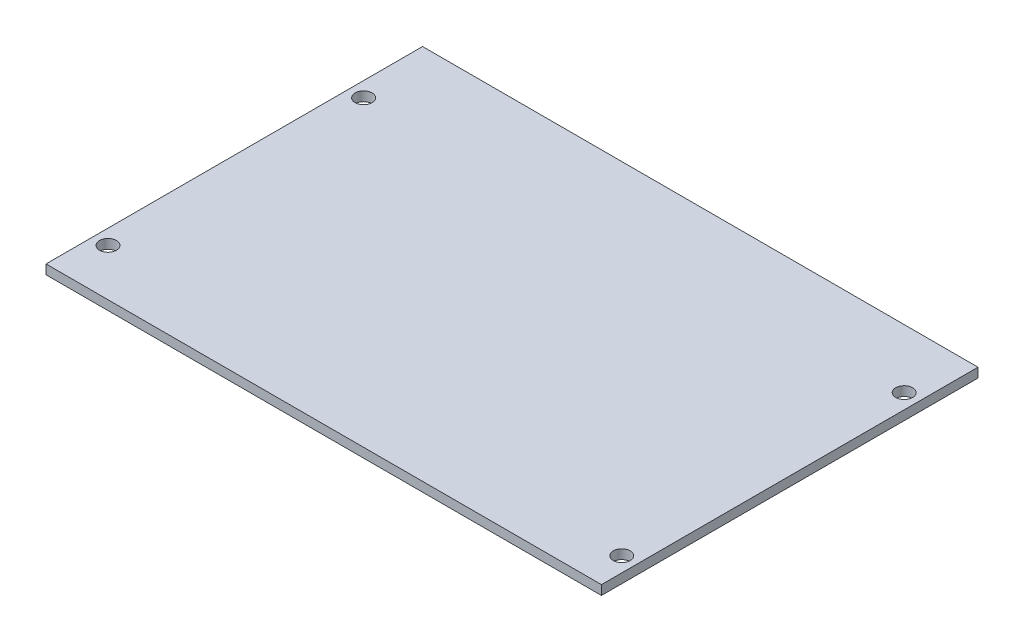
ISO-10303-21;
HEADER;
FILE_DESCRIPTION(('STEP AP214'),'2;1');
FILE_NAME('part.step','',(''),(''),'','','');
FILE_SCHEMA(('AUTOMOTIVE_DESIGN { 1 0 10303 214 1 1 1 1 }'));
ENDSEC;
DATA;
#1=APPLICATION_CONTEXT('core data for automotive mechanical design processes');
#2=APPLICATION_PROTOCOL_DEFINITION('international standard','automotive_design',2000,#1);
#3=PRODUCT_CONTEXT('',#1,'mechanical');
#4=PRODUCT('Part','Part','',(#3));
#5=PRODUCT_RELATED_PRODUCT_CATEGORY('part','',(#4));
#6=PRODUCT_DEFINITION_FORMATION('','',#4);
#7=PRODUCT_DEFINITION_CONTEXT('part definition',#1,'design');
#8=PRODUCT_DEFINITION('design','',#6,#7);
#9=PRODUCT_DEFINITION_SHAPE('','',#8);
#10=(LENGTH_UNIT() NAMED_UNIT(*) SI_UNIT(.MILLI.,.METRE.));
#11=(NAMED_UNIT(*) PLANE_ANGLE_UNIT() SI_UNIT($,.RADIAN.));
#12=(NAMED_UNIT(*) SI_UNIT($,.STERADIAN.) SOLID_ANGLE_UNIT());
#13=UNCERTAINTY_MEASURE_WITH_UNIT(LENGTH_MEASURE(1.E-05),#10,'distance_accuracy_value','');
#14=(GEOMETRIC_REPRESENTATION_CONTEXT(3) GLOBAL_UNCERTAINTY_ASSIGNED_CONTEXT((#13)) GLOBAL_UNIT_ASSIGNED_CONTEXT((#10,
#11,#12)) REPRESENTATION_CONTEXT('',''));
#15=CARTESIAN_POINT('',(0.,0.,0.));
#16=DIRECTION('',(0.,0.,1.));
#17=DIRECTION('',(1.,0.,0.));
#18=AXIS2_PLACEMENT_3D('',#15,#16,#17);
#19=CARTESIAN_POINT('',(0.,3.,0.));
#20=DIRECTION('',(0.,-1.,0.));
#21=DIRECTION('',(0.,0.,-1.));
#22=AXIS2_PLACEMENT_3D('',#19,#20,#21);
#23=PLANE('',#22);
#24=DIRECTION('',(0.,0.,-1.));
#25=VECTOR('',#24,1.);
#26=CARTESIAN_POINT('',(88.5,3.,60.));
#27=LINE('',#26,#25);
#28=CARTESIAN_POINT('',(88.5,3.,60.));
#29=VERTEX_POINT('',#28);
#30=CARTESIAN_POINT('',(88.5,3.,-60.));
#31=VERTEX_POINT('',#30);
#32=EDGE_CURVE('E85',#29,#31,#27,.T.);
#33=ORIENTED_EDGE('',*,*,#32,.T.);
#34=DIRECTION('',(-1.,0.,0.));
#35=VECTOR('',#34,1.);
#36=CARTESIAN_POINT('',(-88.5,3.,-60.));
#37=LINE('',#36,#35);
#38=CARTESIAN_POINT('',(-88.5,3.,-60.));
#39=VERTEX_POINT('',#38);
#40=EDGE_CURVE('E80',#31,#39,#37,.T.);
#41=ORIENTED_EDGE('',*,*,#40,.T.);
#42=DIRECTION('',(0.,0.,1.));
#43=VECTOR('',#42,1.);
#44=CARTESIAN_POINT('',(-88.5,3.,60.));
#45=LINE('',#44,#43);
#46=CARTESIAN_POINT('',(-88.5,3.,60.));
#47=VERTEX_POINT('',#46);
#48=EDGE_CURVE('E83',#39,#47,#45,.T.);
#49=ORIENTED_EDGE('',*,*,#48,.T.);
#50=DIRECTION('',(1.,0.,0.));
#51=VECTOR('',#50,1.);
#52=CARTESIAN_POINT('',(-88.5,3.,60.));
#53=LINE('',#52,#51);
#54=EDGE_CURVE('E50',#47,#29,#53,.T.);
#55=ORIENTED_EDGE('',*,*,#54,.T.);
#56=EDGE_LOOP('',(#33,#41,#49,#55));
#57=FACE_BOUND('',#56,.T.);
#58=CARTESIAN_POINT('',(-83.75,3.,-36.4545267955536));
#59=DIRECTION('',(0.,1.,0.));
#60=DIRECTION('',(0.,0.,1.));
#61=AXIS2_PLACEMENT_3D('',#58,#59,#60);
#62=CIRCLE('',#61,2.7);
#63=CARTESIAN_POINT('',(-83.75,3.,-33.7545267955536));
#64=VERTEX_POINT('',#63);
#65=EDGE_CURVE('E100',#64,#64,#62,.T.);
#66=ORIENTED_EDGE('',*,*,#65,.F.);
#67=EDGE_LOOP('',(#66));
#68=FACE_BOUND('',#67,.T.);
#69=CARTESIAN_POINT('',(83.75,3.,-41.2221669870636));
#70=DIRECTION('',(0.,1.,0.));
#71=DIRECTION('',(0.,0.,1.));
#72=AXIS2_PLACEMENT_3D('',#69,#70,#71);
#73=CIRCLE('',#72,2.7);
#74=CARTESIAN_POINT('',(83.75,3.,-38.5221669870635));
#75=VERTEX_POINT('',#74);
#76=EDGE_CURVE('E115',#75,#75,#73,.T.);
#77=ORIENTED_EDGE('',*,*,#76,.F.);
#78=EDGE_LOOP('',(#77));
#79=FACE_BOUND('',#78,.T.);
#80=CARTESIAN_POINT('',(83.75,3.,48.7778330129364));
#81=DIRECTION('',(0.,1.,0.));
#82=DIRECTION('',(0.,0.,1.));
#83=AXIS2_PLACEMENT_3D('',#80,#81,#82);
#84=CIRCLE('',#83,2.7);
#85=CARTESIAN_POINT('',(83.75,3.,51.4778330129364));
#86=VERTEX_POINT('',#85);
#87=EDGE_CURVE('E121',#86,#86,#84,.T.);
#88=ORIENTED_EDGE('',*,*,#87,.F.);
#89=EDGE_LOOP('',(#88));
#90=FACE_BOUND('',#89,.T.);
#91=CARTESIAN_POINT('',(-83.75,3.,45.));
#92=DIRECTION('',(0.,1.,0.));
#93=DIRECTION('',(0.,0.,1.));
#94=AXIS2_PLACEMENT_3D('',#91,#92,#93);
#95=CIRCLE('',#94,2.7);
#96=CARTESIAN_POINT('',(-83.75,3.,47.7));
#97=VERTEX_POINT('',#96);
#98=EDGE_CURVE('E127',#97,#97,#95,.T.);
#99=ORIENTED_EDGE('',*,*,#98,.F.);
#100=EDGE_LOOP('',(#99));
#101=FACE_BOUND('',#100,.T.);
#102=ADVANCED_FACE('F33',(#57,#68,#79,#90,#101),#23,.F.);
#103=CARTESIAN_POINT('',(0.,0.,0.));
#104=DIRECTION('',(0.,-1.,0.));
#105=DIRECTION('',(0.,0.,-1.));
#106=AXIS2_PLACEMENT_3D('',#103,#104,#105);
#107=PLANE('',#106);
#108=CARTESIAN_POINT('',(83.75,0.,48.7778330129364));
#109=DIRECTION('',(0.,1.,0.));
#110=DIRECTION('',(0.,0.,1.));
#111=AXIS2_PLACEMENT_3D('',#108,#109,#110);
#112=CIRCLE('',#111,2.7);
#113=CARTESIAN_POINT('',(83.75,0.,51.4778330129364));
#114=VERTEX_POINT('',#113);
#115=EDGE_CURVE('E124',#114,#114,#112,.T.);
#116=ORIENTED_EDGE('',*,*,#115,.T.);
#117=EDGE_LOOP('',(#116));
#118=FACE_BOUND('',#117,.T.);
#119=CARTESIAN_POINT('',(-83.75,0.,-36.4545267955536));
#120=DIRECTION('',(0.,1.,0.));
#121=DIRECTION('',(0.,0.,1.));
#122=AXIS2_PLACEMENT_3D('',#119,#120,#121);
#123=CIRCLE('',#122,2.7);
#124=CARTESIAN_POINT('',(-83.75,0.,-33.7545267955536));
#125=VERTEX_POINT('',#124);
#126=EDGE_CURVE('E112',#125,#125,#123,.T.);
#127=ORIENTED_EDGE('',*,*,#126,.T.);
#128=EDGE_LOOP('',(#127));
#129=FACE_BOUND('',#128,.T.);
#130=DIRECTION('',(0.,0.,-1.));
#131=VECTOR('',#130,1.);
#132=CARTESIAN_POINT('',(88.5,0.,60.));
#133=LINE('',#132,#131);
#134=CARTESIAN_POINT('',(88.5,0.,60.));
#135=VERTEX_POINT('',#134);
#136=CARTESIAN_POINT('',(88.5,0.,-60.));
#137=VERTEX_POINT('',#136);
#138=EDGE_CURVE('E97',#135,#137,#133,.T.);
#139=ORIENTED_EDGE('',*,*,#138,.F.);
#140=DIRECTION('',(1.,0.,0.));
#141=VECTOR('',#140,1.);
#142=CARTESIAN_POINT('',(-88.5,0.,60.));
#143=LINE('',#142,#141);
#144=CARTESIAN_POINT('',(-88.5,0.,60.));
#145=VERTEX_POINT('',#144);
#146=EDGE_CURVE('E73',#145,#135,#143,.T.);
#147=ORIENTED_EDGE('',*,*,#146,.F.);
#148=DIRECTION('',(0.,0.,1.));
#149=VECTOR('',#148,1.);
#150=CARTESIAN_POINT('',(-88.5,0.,60.));
#151=LINE('',#150,#149);
#152=CARTESIAN_POINT('',(-88.5,0.,-60.));
#153=VERTEX_POINT('',#152);
#154=EDGE_CURVE('E67',#153,#145,#151,.T.);
#155=ORIENTED_EDGE('',*,*,#154,.F.);
#156=DIRECTION('',(-1.,0.,0.));
#157=VECTOR('',#156,1.);
#158=CARTESIAN_POINT('',(-88.5,0.,-60.));
#159=LINE('',#158,#157);
#160=EDGE_CURVE('E89',#137,#153,#159,.T.);
#161=ORIENTED_EDGE('',*,*,#160,.F.);
#162=EDGE_LOOP('',(#139,#147,#155,#161));
#163=FACE_BOUND('',#162,.T.);
#164=CARTESIAN_POINT('',(83.75,0.,-41.2221669870636));
#165=DIRECTION('',(0.,1.,0.));
#166=DIRECTION('',(0.,0.,1.));
#167=AXIS2_PLACEMENT_3D('',#164,#165,#166);
#168=CIRCLE('',#167,2.7);
#169=CARTESIAN_POINT('',(83.75,0.,-38.5221669870635));
#170=VERTEX_POINT('',#169);
#171=EDGE_CURVE('E118',#170,#170,#168,.T.);
#172=ORIENTED_EDGE('',*,*,#171,.T.);
#173=EDGE_LOOP('',(#172));
#174=FACE_BOUND('',#173,.T.);
#175=CARTESIAN_POINT('',(-83.75,0.,45.));
#176=DIRECTION('',(0.,1.,0.));
#177=DIRECTION('',(0.,0.,1.));
#178=AXIS2_PLACEMENT_3D('',#175,#176,#177);
#179=CIRCLE('',#178,2.7);
#180=CARTESIAN_POINT('',(-83.75,0.,47.7));
#181=VERTEX_POINT('',#180);
#182=EDGE_CURVE('E130',#181,#181,#179,.T.);
#183=ORIENTED_EDGE('',*,*,#182,.T.);
#184=EDGE_LOOP('',(#183));
#185=FACE_BOUND('',#184,.T.);
#186=ADVANCED_FACE('F108',(#118,#129,#163,#174,#185),#107,.T.);
#187=CARTESIAN_POINT('',(88.5,3.,60.));
#188=DIRECTION('',(-1.,0.,0.));
#189=DIRECTION('',(0.,0.,1.));
#190=AXIS2_PLACEMENT_3D('',#187,#188,#189);
#191=PLANE('',#190);
#192=ORIENTED_EDGE('',*,*,#138,.T.);
#193=DIRECTION('',(0.,-1.,0.));
#194=VECTOR('',#193,1.);
#195=CARTESIAN_POINT('',(88.5,3.,-60.));
#196=LINE('',#195,#194);
#197=EDGE_CURVE('E11',#31,#137,#196,.T.);
#198=ORIENTED_EDGE('',*,*,#197,.F.);
#199=ORIENTED_EDGE('',*,*,#32,.F.);
#200=DIRECTION('',(0.,-1.,0.));
#201=VECTOR('',#200,1.);
#202=CARTESIAN_POINT('',(88.5,3.,60.));
#203=LINE('',#202,#201);
#204=EDGE_CURVE('E93',#29,#135,#203,.T.);
#205=ORIENTED_EDGE('',*,*,#204,.T.);
#206=EDGE_LOOP('',(#192,#198,#199,#205));
#207=FACE_BOUND('',#206,.T.);
#208=ADVANCED_FACE('F35',(#207),#191,.F.);
#209=CARTESIAN_POINT('',(-88.5,3.,-60.));
#210=DIRECTION('',(0.,0.,1.));
#211=DIRECTION('',(1.,0.,0.));
#212=AXIS2_PLACEMENT_3D('',#209,#210,#211);
#213=PLANE('',#212);
#214=ORIENTED_EDGE('',*,*,#160,.T.);
#215=DIRECTION('',(0.,-1.,0.));
#216=VECTOR('',#215,1.);
#217=CARTESIAN_POINT('',(-88.5,3.,-60.));
#218=LINE('',#217,#216);
#219=EDGE_CURVE('E42',#39,#153,#218,.T.);
#220=ORIENTED_EDGE('',*,*,#219,.F.);
#221=ORIENTED_EDGE('',*,*,#40,.F.);
#222=ORIENTED_EDGE('',*,*,#197,.T.);
#223=EDGE_LOOP('',(#214,#220,#221,#222));
#224=FACE_BOUND('',#223,.T.);
#225=ADVANCED_FACE('F88',(#224),#213,.F.);
#226=CARTESIAN_POINT('',(-88.5,3.,60.));
#227=DIRECTION('',(1.,0.,0.));
#228=DIRECTION('',(0.,0.,-1.));
#229=AXIS2_PLACEMENT_3D('',#226,#227,#228);
#230=PLANE('',#229);
#231=ORIENTED_EDGE('',*,*,#154,.T.);
#232=DIRECTION('',(0.,-1.,0.));
#233=VECTOR('',#232,1.);
#234=CARTESIAN_POINT('',(-88.5,3.,60.));
#235=LINE('',#234,#233);
#236=EDGE_CURVE('E90',#47,#145,#235,.T.);
#237=ORIENTED_EDGE('',*,*,#236,.F.);
#238=ORIENTED_EDGE('',*,*,#48,.F.);
#239=ORIENTED_EDGE('',*,*,#219,.T.);
#240=EDGE_LOOP('',(#231,#237,#238,#239));
#241=FACE_BOUND('',#240,.T.);
#242=ADVANCED_FACE('F91',(#241),#230,.F.);
#243=CARTESIAN_POINT('',(-88.5,3.,60.));
#244=DIRECTION('',(0.,0.,-1.));
#245=DIRECTION('',(-1.,0.,0.));
#246=AXIS2_PLACEMENT_3D('',#243,#244,#245);
#247=PLANE('',#246);
#248=ORIENTED_EDGE('',*,*,#146,.T.);
#249=ORIENTED_EDGE('',*,*,#204,.F.);
#250=ORIENTED_EDGE('',*,*,#54,.F.);
#251=ORIENTED_EDGE('',*,*,#236,.T.);
#252=EDGE_LOOP('',(#248,#249,#250,#251));
#253=FACE_BOUND('',#252,.T.);
#254=ADVANCED_FACE('F105',(#253),#247,.F.);
#255=CARTESIAN_POINT('',(-83.75,3.,-36.4545267955536));
#256=DIRECTION('',(0.,-1.,0.));
#257=DIRECTION('',(0.,0.,-1.));
#258=AXIS2_PLACEMENT_3D('',#255,#256,#257);
#259=CYLINDRICAL_SURFACE('',#258,2.7);
#260=ORIENTED_EDGE('',*,*,#65,.T.);
#261=EDGE_LOOP('',(#260));
#262=FACE_BOUND('',#261,.T.);
#263=ORIENTED_EDGE('',*,*,#126,.F.);
#264=EDGE_LOOP('',(#263));
#265=FACE_BOUND('',#264,.T.);
#266=ADVANCED_FACE('F147',(#262,#265),#259,.F.);
#267=CARTESIAN_POINT('',(83.75,3.,-41.2221669870636));
#268=DIRECTION('',(0.,-1.,0.));
#269=DIRECTION('',(0.,0.,-1.));
#270=AXIS2_PLACEMENT_3D('',#267,#268,#269);
#271=CYLINDRICAL_SURFACE('',#270,2.7);
#272=ORIENTED_EDGE('',*,*,#76,.T.);
#273=EDGE_LOOP('',(#272));
#274=FACE_BOUND('',#273,.T.);
#275=ORIENTED_EDGE('',*,*,#171,.F.);
#276=EDGE_LOOP('',(#275));
#277=FACE_BOUND('',#276,.T.);
#278=ADVANCED_FACE('F193',(#274,#277),#271,.F.);
#279=CARTESIAN_POINT('',(83.75,3.,48.7778330129364));
#280=DIRECTION('',(0.,-1.,0.));
#281=DIRECTION('',(0.,0.,-1.));
#282=AXIS2_PLACEMENT_3D('',#279,#280,#281);
#283=CYLINDRICAL_SURFACE('',#282,2.7);
#284=ORIENTED_EDGE('',*,*,#87,.T.);
#285=EDGE_LOOP('',(#284));
#286=FACE_BOUND('',#285,.T.);
#287=ORIENTED_EDGE('',*,*,#115,.F.);
#288=EDGE_LOOP('',(#287));
#289=FACE_BOUND('',#288,.T.);
#290=ADVANCED_FACE('F201',(#286,#289),#283,.F.);
#291=CARTESIAN_POINT('',(-83.75,3.,45.));
#292=DIRECTION('',(0.,-1.,0.));
#293=DIRECTION('',(0.,0.,-1.));
#294=AXIS2_PLACEMENT_3D('',#291,#292,#293);
#295=CYLINDRICAL_SURFACE('',#294,2.7);
#296=ORIENTED_EDGE('',*,*,#98,.T.);
#297=EDGE_LOOP('',(#296));
#298=FACE_BOUND('',#297,.T.);
#299=ORIENTED_EDGE('',*,*,#182,.F.);
#300=EDGE_LOOP('',(#299));
#301=FACE_BOUND('',#300,.T.);
#302=ADVANCED_FACE('F136',(#298,#301),#295,.F.);
#303=CLOSED_SHELL('',(#102,#186,#208,#225,#242,#254,#266,#278,#290,#302));
#304=MANIFOLD_SOLID_BREP('B2',#303);
#305=ADVANCED_BREP_SHAPE_REPRESENTATION('',(#18,#304),#14);
#306=SHAPE_DEFINITION_REPRESENTATION(#9,#305);
ENDSEC;
END-ISO-10303-21;
